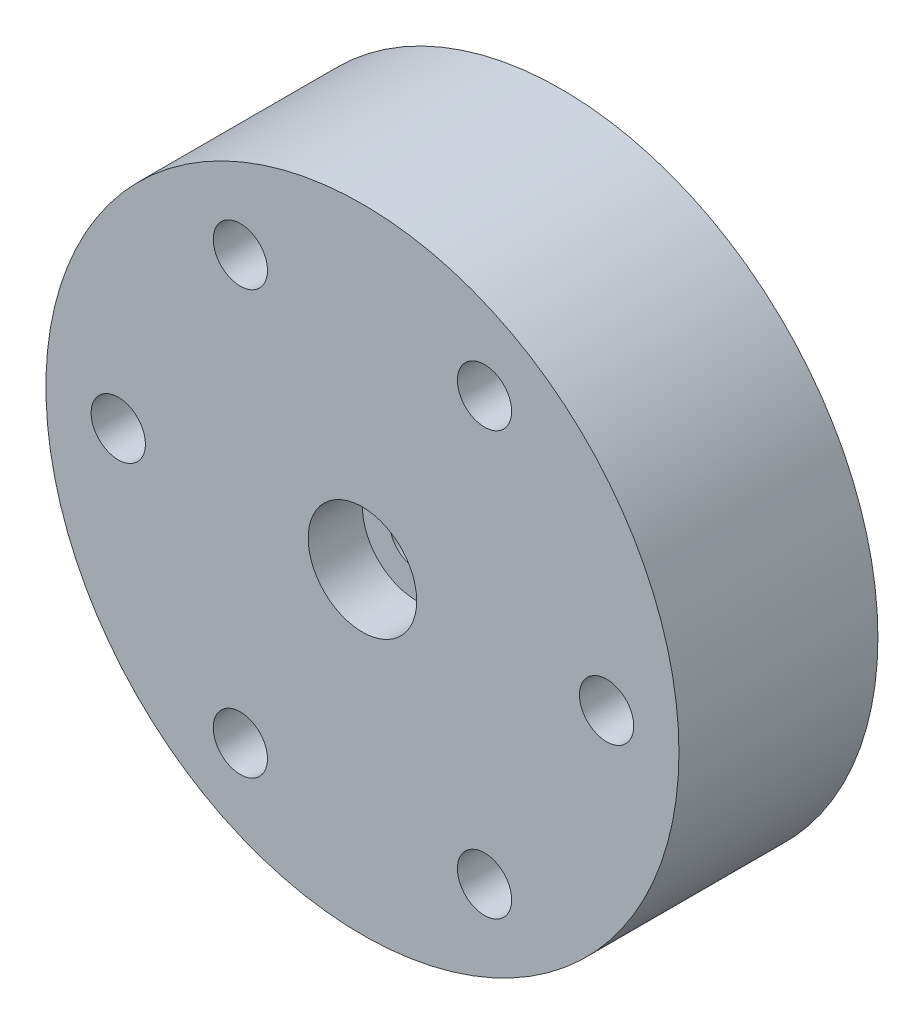
ISO-10303-21;
HEADER;
FILE_DESCRIPTION(('STEP AP214'),'2;1');
FILE_NAME('part.step','',(''),(''),'','','');
FILE_SCHEMA(('AUTOMOTIVE_DESIGN { 1 0 10303 214 1 1 1 1 }'));
ENDSEC;
DATA;
#1=APPLICATION_CONTEXT('core data for automotive mechanical design processes');
#2=APPLICATION_PROTOCOL_DEFINITION('international standard','automotive_design',2000,#1);
#3=PRODUCT_CONTEXT('',#1,'mechanical');
#4=PRODUCT('Part','Part','',(#3));
#5=PRODUCT_RELATED_PRODUCT_CATEGORY('part','',(#4));
#6=PRODUCT_DEFINITION_FORMATION('','',#4);
#7=PRODUCT_DEFINITION_CONTEXT('part definition',#1,'design');
#8=PRODUCT_DEFINITION('design','',#6,#7);
#9=PRODUCT_DEFINITION_SHAPE('','',#8);
#10=(LENGTH_UNIT() NAMED_UNIT(*) SI_UNIT(.MILLI.,.METRE.));
#11=(NAMED_UNIT(*) PLANE_ANGLE_UNIT() SI_UNIT($,.RADIAN.));
#12=(NAMED_UNIT(*) SI_UNIT($,.STERADIAN.) SOLID_ANGLE_UNIT());
#13=UNCERTAINTY_MEASURE_WITH_UNIT(LENGTH_MEASURE(1.E-05),#10,'distance_accuracy_value','');
#14=(GEOMETRIC_REPRESENTATION_CONTEXT(3) GLOBAL_UNCERTAINTY_ASSIGNED_CONTEXT((#13)) GLOBAL_UNIT_ASSIGNED_CONTEXT((#10,
#11,#12)) REPRESENTATION_CONTEXT('',''));
#15=CARTESIAN_POINT('',(0.,0.,0.));
#16=DIRECTION('',(0.,0.,1.));
#17=DIRECTION('',(1.,0.,0.));
#18=AXIS2_PLACEMENT_3D('',#15,#16,#17);
#19=CARTESIAN_POINT('',(0.,0.,11.));
#20=DIRECTION('',(0.,0.,-1.));
#21=DIRECTION('',(-1.,0.,0.));
#22=AXIS2_PLACEMENT_3D('',#19,#20,#21);
#23=CYLINDRICAL_SURFACE('',#22,17.5);
#24=CARTESIAN_POINT('',(0.,0.,11.));
#25=DIRECTION('',(0.,0.,1.));
#26=DIRECTION('',(1.,0.,0.));
#27=AXIS2_PLACEMENT_3D('',#24,#25,#26);
#28=CIRCLE('',#27,17.5);
#29=CARTESIAN_POINT('',(17.5,0.,11.));
#30=VERTEX_POINT('',#29);
#31=EDGE_CURVE('E10',#30,#30,#28,.T.);
#32=ORIENTED_EDGE('',*,*,#31,.F.);
#33=EDGE_LOOP('',(#32));
#34=FACE_BOUND('',#33,.T.);
#35=CARTESIAN_POINT('',(0.,0.,0.));
#36=DIRECTION('',(0.,0.,1.));
#37=DIRECTION('',(1.,0.,0.));
#38=AXIS2_PLACEMENT_3D('',#35,#36,#37);
#39=CIRCLE('',#38,17.5);
#40=CARTESIAN_POINT('',(17.5,0.,0.));
#41=VERTEX_POINT('',#40);
#42=EDGE_CURVE('E43',#41,#41,#39,.T.);
#43=ORIENTED_EDGE('',*,*,#42,.T.);
#44=EDGE_LOOP('',(#43));
#45=FACE_BOUND('',#44,.T.);
#46=ADVANCED_FACE('F40',(#34,#45),#23,.T.);
#47=CARTESIAN_POINT('',(0.,0.,11.));
#48=DIRECTION('',(0.,0.,1.));
#49=DIRECTION('',(1.,0.,0.));
#50=AXIS2_PLACEMENT_3D('',#47,#48,#49);
#51=PLANE('',#50);
#52=CARTESIAN_POINT('',(0.,0.,11.));
#53=DIRECTION('',(0.,0.,1.));
#54=DIRECTION('',(1.,0.,0.));
#55=AXIS2_PLACEMENT_3D('',#52,#53,#54);
#56=CIRCLE('',#55,3.);
#57=CARTESIAN_POINT('',(3.,0.,11.));
#58=VERTEX_POINT('',#57);
#59=EDGE_CURVE('E102',#58,#58,#56,.T.);
#60=ORIENTED_EDGE('',*,*,#59,.F.);
#61=EDGE_LOOP('',(#60));
#62=FACE_BOUND('',#61,.T.);
#63=CARTESIAN_POINT('',(6.75000000000014,-11.6913429510898,11.));
#64=DIRECTION('',(0.,0.,1.));
#65=DIRECTION('',(0.50000000000001,-0.866025403784433,0.));
#66=AXIS2_PLACEMENT_3D('',#63,#64,#65);
#67=CIRCLE('',#66,1.5);
#68=CARTESIAN_POINT('',(7.50000000000015,-12.9903810567665,11.));
#69=VERTEX_POINT('',#68);
#70=EDGE_CURVE('E70',#69,#69,#67,.T.);
#71=ORIENTED_EDGE('',*,*,#70,.F.);
#72=EDGE_LOOP('',(#71));
#73=FACE_BOUND('',#72,.T.);
#74=CARTESIAN_POINT('',(-6.74999999999989,-11.69134295109,11.));
#75=DIRECTION('',(0.,0.,1.));
#76=DIRECTION('',(-0.499999999999992,-0.866025403784443,0.));
#77=AXIS2_PLACEMENT_3D('',#74,#75,#76);
#78=CIRCLE('',#77,1.5);
#79=CARTESIAN_POINT('',(-7.49999999999988,-12.9903810567666,11.));
#80=VERTEX_POINT('',#79);
#81=EDGE_CURVE('E79',#80,#80,#78,.T.);
#82=ORIENTED_EDGE('',*,*,#81,.F.);
#83=EDGE_LOOP('',(#82));
#84=FACE_BOUND('',#83,.T.);
#85=CARTESIAN_POINT('',(-13.5,0.,11.));
#86=DIRECTION('',(0.,0.,1.));
#87=DIRECTION('',(-1.,0.,0.));
#88=AXIS2_PLACEMENT_3D('',#85,#86,#87);
#89=CIRCLE('',#88,1.5);
#90=CARTESIAN_POINT('',(-15.,0.,11.));
#91=VERTEX_POINT('',#90);
#92=EDGE_CURVE('E87',#91,#91,#89,.T.);
#93=ORIENTED_EDGE('',*,*,#92,.F.);
#94=EDGE_LOOP('',(#93));
#95=FACE_BOUND('',#94,.T.);
#96=CARTESIAN_POINT('',(-6.75000000000006,11.6913429510899,11.));
#97=DIRECTION('',(0.,0.,1.));
#98=DIRECTION('',(-0.500000000000004,0.866025403784436,0.));
#99=AXIS2_PLACEMENT_3D('',#96,#97,#98);
#100=CIRCLE('',#99,1.5);
#101=CARTESIAN_POINT('',(-7.50000000000006,12.9903810567665,11.));
#102=VERTEX_POINT('',#101);
#103=EDGE_CURVE('E95',#102,#102,#100,.T.);
#104=ORIENTED_EDGE('',*,*,#103,.F.);
#105=EDGE_LOOP('',(#104));
#106=FACE_BOUND('',#105,.T.);
#107=CARTESIAN_POINT('',(6.74999999999997,11.6913429510899,11.));
#108=DIRECTION('',(0.,0.,1.));
#109=DIRECTION('',(0.499999999999998,0.86602540378444,0.));
#110=AXIS2_PLACEMENT_3D('',#107,#108,#109);
#111=CIRCLE('',#110,1.5);
#112=CARTESIAN_POINT('',(7.49999999999997,12.9903810567666,11.));
#113=VERTEX_POINT('',#112);
#114=EDGE_CURVE('E62',#113,#113,#111,.T.);
#115=ORIENTED_EDGE('',*,*,#114,.F.);
#116=EDGE_LOOP('',(#115));
#117=FACE_BOUND('',#116,.T.);
#118=CARTESIAN_POINT('',(13.5,0.,11.));
#119=DIRECTION('',(0.,0.,1.));
#120=DIRECTION('',(1.,0.,0.));
#121=AXIS2_PLACEMENT_3D('',#118,#119,#120);
#122=CIRCLE('',#121,1.5);
#123=CARTESIAN_POINT('',(15.,0.,11.));
#124=VERTEX_POINT('',#123);
#125=EDGE_CURVE('E54',#124,#124,#122,.T.);
#126=ORIENTED_EDGE('',*,*,#125,.F.);
#127=EDGE_LOOP('',(#126));
#128=FACE_BOUND('',#127,.T.);
#129=ORIENTED_EDGE('',*,*,#31,.T.);
#130=EDGE_LOOP('',(#129));
#131=FACE_BOUND('',#130,.T.);
#132=ADVANCED_FACE('F139',(#62,#73,#84,#95,#106,#117,#128,#131),#51,.T.);
#133=CARTESIAN_POINT('',(0.,0.,0.));
#134=DIRECTION('',(0.,0.,1.));
#135=DIRECTION('',(1.,0.,0.));
#136=AXIS2_PLACEMENT_3D('',#133,#134,#135);
#137=PLANE('',#136);
#138=ORIENTED_EDGE('',*,*,#42,.F.);
#139=EDGE_LOOP('',(#138));
#140=FACE_BOUND('',#139,.T.);
#141=ADVANCED_FACE('F142',(#140),#137,.F.);
#142=CARTESIAN_POINT('',(13.5,0.,6.));
#143=DIRECTION('',(0.,0.,1.));
#144=DIRECTION('',(1.,0.,0.));
#145=AXIS2_PLACEMENT_3D('',#142,#143,#144);
#146=CYLINDRICAL_SURFACE('',#145,1.5);
#147=CARTESIAN_POINT('',(13.5,0.,6.));
#148=DIRECTION('',(0.,0.,1.));
#149=DIRECTION('',(1.,0.,0.));
#150=AXIS2_PLACEMENT_3D('',#147,#148,#149);
#151=CIRCLE('',#150,1.5);
#152=CARTESIAN_POINT('',(15.,0.,6.));
#153=VERTEX_POINT('',#152);
#154=EDGE_CURVE('E52',#153,#153,#151,.T.);
#155=ORIENTED_EDGE('',*,*,#154,.F.);
#156=EDGE_LOOP('',(#155));
#157=FACE_BOUND('',#156,.T.);
#158=ORIENTED_EDGE('',*,*,#125,.T.);
#159=EDGE_LOOP('',(#158));
#160=FACE_BOUND('',#159,.T.);
#161=ADVANCED_FACE('F156',(#157,#160),#146,.F.);
#162=CARTESIAN_POINT('',(13.5,0.,6.));
#163=DIRECTION('',(0.,0.,1.));
#164=DIRECTION('',(1.,0.,0.));
#165=AXIS2_PLACEMENT_3D('',#162,#163,#164);
#166=PLANE('',#165);
#167=ORIENTED_EDGE('',*,*,#154,.T.);
#168=EDGE_LOOP('',(#167));
#169=FACE_BOUND('',#168,.T.);
#170=ADVANCED_FACE('F158',(#169),#166,.T.);
#171=CARTESIAN_POINT('',(6.74999999999997,11.6913429510899,6.));
#172=DIRECTION('',(0.,0.,1.));
#173=DIRECTION('',(1.,0.,0.));
#174=AXIS2_PLACEMENT_3D('',#171,#172,#173);
#175=CYLINDRICAL_SURFACE('',#174,1.5);
#176=CARTESIAN_POINT('',(6.74999999999997,11.6913429510899,6.));
#177=DIRECTION('',(0.,0.,1.));
#178=DIRECTION('',(0.499999999999998,0.86602540378444,0.));
#179=AXIS2_PLACEMENT_3D('',#176,#177,#178);
#180=CIRCLE('',#179,1.5);
#181=CARTESIAN_POINT('',(7.49999999999997,12.9903810567666,6.));
#182=VERTEX_POINT('',#181);
#183=EDGE_CURVE('E58',#182,#182,#180,.T.);
#184=ORIENTED_EDGE('',*,*,#183,.F.);
#185=EDGE_LOOP('',(#184));
#186=FACE_BOUND('',#185,.T.);
#187=ORIENTED_EDGE('',*,*,#114,.T.);
#188=EDGE_LOOP('',(#187));
#189=FACE_BOUND('',#188,.T.);
#190=ADVANCED_FACE('F165',(#186,#189),#175,.F.);
#191=CARTESIAN_POINT('',(6.74999999999997,11.6913429510899,6.));
#192=DIRECTION('',(0.,0.,1.));
#193=DIRECTION('',(0.499999999999998,0.86602540378444,0.));
#194=AXIS2_PLACEMENT_3D('',#191,#192,#193);
#195=PLANE('',#194);
#196=ORIENTED_EDGE('',*,*,#183,.T.);
#197=EDGE_LOOP('',(#196));
#198=FACE_BOUND('',#197,.T.);
#199=ADVANCED_FACE('F208',(#198),#195,.T.);
#200=CARTESIAN_POINT('',(-6.75000000000006,11.6913429510899,6.));
#201=DIRECTION('',(0.,0.,1.));
#202=DIRECTION('',(1.,0.,0.));
#203=AXIS2_PLACEMENT_3D('',#200,#201,#202);
#204=CYLINDRICAL_SURFACE('',#203,1.5);
#205=CARTESIAN_POINT('',(-6.75000000000006,11.6913429510899,6.));
#206=DIRECTION('',(0.,0.,1.));
#207=DIRECTION('',(-0.500000000000004,0.866025403784436,0.));
#208=AXIS2_PLACEMENT_3D('',#205,#206,#207);
#209=CIRCLE('',#208,1.5);
#210=CARTESIAN_POINT('',(-7.50000000000006,12.9903810567665,6.));
#211=VERTEX_POINT('',#210);
#212=EDGE_CURVE('E66',#211,#211,#209,.T.);
#213=ORIENTED_EDGE('',*,*,#212,.F.);
#214=EDGE_LOOP('',(#213));
#215=FACE_BOUND('',#214,.T.);
#216=ORIENTED_EDGE('',*,*,#103,.T.);
#217=EDGE_LOOP('',(#216));
#218=FACE_BOUND('',#217,.T.);
#219=ADVANCED_FACE('F219',(#215,#218),#204,.F.);
#220=CARTESIAN_POINT('',(-6.75000000000006,11.6913429510899,6.));
#221=DIRECTION('',(0.,0.,1.));
#222=DIRECTION('',(-0.500000000000004,0.866025403784436,0.));
#223=AXIS2_PLACEMENT_3D('',#220,#221,#222);
#224=PLANE('',#223);
#225=ORIENTED_EDGE('',*,*,#212,.T.);
#226=EDGE_LOOP('',(#225));
#227=FACE_BOUND('',#226,.T.);
#228=ADVANCED_FACE('F230',(#227),#224,.T.);
#229=CARTESIAN_POINT('',(-13.5,0.,6.));
#230=DIRECTION('',(0.,0.,1.));
#231=DIRECTION('',(1.,0.,0.));
#232=AXIS2_PLACEMENT_3D('',#229,#230,#231);
#233=CYLINDRICAL_SURFACE('',#232,1.5);
#234=CARTESIAN_POINT('',(-13.5,0.,6.));
#235=DIRECTION('',(0.,0.,1.));
#236=DIRECTION('',(-1.,0.,0.));
#237=AXIS2_PLACEMENT_3D('',#234,#235,#236);
#238=CIRCLE('',#237,1.5);
#239=CARTESIAN_POINT('',(-15.,0.,6.));
#240=VERTEX_POINT('',#239);
#241=EDGE_CURVE('E91',#240,#240,#238,.T.);
#242=ORIENTED_EDGE('',*,*,#241,.F.);
#243=EDGE_LOOP('',(#242));
#244=FACE_BOUND('',#243,.T.);
#245=ORIENTED_EDGE('',*,*,#92,.T.);
#246=EDGE_LOOP('',(#245));
#247=FACE_BOUND('',#246,.T.);
#248=ADVANCED_FACE('F241',(#244,#247),#233,.F.);
#249=CARTESIAN_POINT('',(-13.5,0.,6.));
#250=DIRECTION('',(0.,0.,1.));
#251=DIRECTION('',(-1.,0.,0.));
#252=AXIS2_PLACEMENT_3D('',#249,#250,#251);
#253=PLANE('',#252);
#254=ORIENTED_EDGE('',*,*,#241,.T.);
#255=EDGE_LOOP('',(#254));
#256=FACE_BOUND('',#255,.T.);
#257=ADVANCED_FACE('F252',(#256),#253,.T.);
#258=CARTESIAN_POINT('',(-6.74999999999989,-11.69134295109,6.));
#259=DIRECTION('',(0.,0.,1.));
#260=DIRECTION('',(1.,0.,0.));
#261=AXIS2_PLACEMENT_3D('',#258,#259,#260);
#262=CYLINDRICAL_SURFACE('',#261,1.5);
#263=CARTESIAN_POINT('',(-6.74999999999989,-11.69134295109,6.));
#264=DIRECTION('',(0.,0.,1.));
#265=DIRECTION('',(-0.499999999999992,-0.866025403784443,0.));
#266=AXIS2_PLACEMENT_3D('',#263,#264,#265);
#267=CIRCLE('',#266,1.5);
#268=CARTESIAN_POINT('',(-7.49999999999988,-12.9903810567666,6.));
#269=VERTEX_POINT('',#268);
#270=EDGE_CURVE('E83',#269,#269,#267,.T.);
#271=ORIENTED_EDGE('',*,*,#270,.F.);
#272=EDGE_LOOP('',(#271));
#273=FACE_BOUND('',#272,.T.);
#274=ORIENTED_EDGE('',*,*,#81,.T.);
#275=EDGE_LOOP('',(#274));
#276=FACE_BOUND('',#275,.T.);
#277=ADVANCED_FACE('F263',(#273,#276),#262,.F.);
#278=CARTESIAN_POINT('',(-6.74999999999989,-11.69134295109,6.));
#279=DIRECTION('',(0.,0.,1.));
#280=DIRECTION('',(-0.499999999999992,-0.866025403784443,0.));
#281=AXIS2_PLACEMENT_3D('',#278,#279,#280);
#282=PLANE('',#281);
#283=ORIENTED_EDGE('',*,*,#270,.T.);
#284=EDGE_LOOP('',(#283));
#285=FACE_BOUND('',#284,.T.);
#286=ADVANCED_FACE('F274',(#285),#282,.T.);
#287=CARTESIAN_POINT('',(6.75000000000014,-11.6913429510898,6.));
#288=DIRECTION('',(0.,0.,1.));
#289=DIRECTION('',(1.,0.,0.));
#290=AXIS2_PLACEMENT_3D('',#287,#288,#289);
#291=CYLINDRICAL_SURFACE('',#290,1.5);
#292=CARTESIAN_POINT('',(6.75000000000014,-11.6913429510898,6.));
#293=DIRECTION('',(0.,0.,1.));
#294=DIRECTION('',(0.50000000000001,-0.866025403784433,0.));
#295=AXIS2_PLACEMENT_3D('',#292,#293,#294);
#296=CIRCLE('',#295,1.5);
#297=CARTESIAN_POINT('',(7.50000000000015,-12.9903810567665,6.));
#298=VERTEX_POINT('',#297);
#299=EDGE_CURVE('E74',#298,#298,#296,.T.);
#300=ORIENTED_EDGE('',*,*,#299,.F.);
#301=EDGE_LOOP('',(#300));
#302=FACE_BOUND('',#301,.T.);
#303=ORIENTED_EDGE('',*,*,#70,.T.);
#304=EDGE_LOOP('',(#303));
#305=FACE_BOUND('',#304,.T.);
#306=ADVANCED_FACE('F285',(#302,#305),#291,.F.);
#307=CARTESIAN_POINT('',(6.75000000000014,-11.6913429510898,6.));
#308=DIRECTION('',(0.,0.,1.));
#309=DIRECTION('',(0.50000000000001,-0.866025403784433,0.));
#310=AXIS2_PLACEMENT_3D('',#307,#308,#309);
#311=PLANE('',#310);
#312=ORIENTED_EDGE('',*,*,#299,.T.);
#313=EDGE_LOOP('',(#312));
#314=FACE_BOUND('',#313,.T.);
#315=ADVANCED_FACE('F135',(#314),#311,.T.);
#316=CARTESIAN_POINT('',(0.,0.,8.));
#317=DIRECTION('',(0.,0.,1.));
#318=DIRECTION('',(1.,0.,0.));
#319=AXIS2_PLACEMENT_3D('',#316,#317,#318);
#320=CYLINDRICAL_SURFACE('',#319,3.);
#321=CARTESIAN_POINT('',(0.,0.,8.));
#322=DIRECTION('',(0.,0.,1.));
#323=DIRECTION('',(1.,0.,0.));
#324=AXIS2_PLACEMENT_3D('',#321,#322,#323);
#325=CIRCLE('',#324,3.);
#326=CARTESIAN_POINT('',(3.,0.,8.));
#327=VERTEX_POINT('',#326);
#328=EDGE_CURVE('E75',#327,#327,#325,.T.);
#329=ORIENTED_EDGE('',*,*,#328,.F.);
#330=EDGE_LOOP('',(#329));
#331=FACE_BOUND('',#330,.T.);
#332=ORIENTED_EDGE('',*,*,#59,.T.);
#333=EDGE_LOOP('',(#332));
#334=FACE_BOUND('',#333,.T.);
#335=ADVANCED_FACE('F129',(#331,#334),#320,.F.);
#336=CARTESIAN_POINT('',(0.,0.,8.));
#337=DIRECTION('',(0.,0.,1.));
#338=DIRECTION('',(1.,0.,0.));
#339=AXIS2_PLACEMENT_3D('',#336,#337,#338);
#340=PLANE('',#339);
#341=CARTESIAN_POINT('',(0.,0.,8.));
#342=DIRECTION('',(0.,0.,1.));
#343=DIRECTION('',(1.,0.,0.));
#344=AXIS2_PLACEMENT_3D('',#341,#342,#343);
#345=CIRCLE('',#344,1.5);
#346=CARTESIAN_POINT('',(1.5,0.,8.));
#347=VERTEX_POINT('',#346);
#348=EDGE_CURVE('E110',#347,#347,#345,.T.);
#349=ORIENTED_EDGE('',*,*,#348,.F.);
#350=EDGE_LOOP('',(#349));
#351=FACE_BOUND('',#350,.T.);
#352=ORIENTED_EDGE('',*,*,#328,.T.);
#353=EDGE_LOOP('',(#352));
#354=FACE_BOUND('',#353,.T.);
#355=ADVANCED_FACE('F123',(#351,#354),#340,.T.);
#356=CARTESIAN_POINT('',(0.,0.,3.));
#357=DIRECTION('',(0.,0.,1.));
#358=DIRECTION('',(1.,0.,0.));
#359=AXIS2_PLACEMENT_3D('',#356,#357,#358);
#360=CYLINDRICAL_SURFACE('',#359,1.5);
#361=CARTESIAN_POINT('',(0.,0.,3.));
#362=DIRECTION('',(0.,0.,1.));
#363=DIRECTION('',(1.,0.,0.));
#364=AXIS2_PLACEMENT_3D('',#361,#362,#363);
#365=CIRCLE('',#364,1.5);
#366=CARTESIAN_POINT('',(1.5,0.,3.));
#367=VERTEX_POINT('',#366);
#368=EDGE_CURVE('E106',#367,#367,#365,.T.);
#369=ORIENTED_EDGE('',*,*,#368,.F.);
#370=EDGE_LOOP('',(#369));
#371=FACE_BOUND('',#370,.T.);
#372=ORIENTED_EDGE('',*,*,#348,.T.);
#373=EDGE_LOOP('',(#372));
#374=FACE_BOUND('',#373,.T.);
#375=ADVANCED_FACE('F120',(#371,#374),#360,.F.);
#376=CARTESIAN_POINT('',(0.,0.,3.));
#377=DIRECTION('',(0.,0.,1.));
#378=DIRECTION('',(1.,0.,0.));
#379=AXIS2_PLACEMENT_3D('',#376,#377,#378);
#380=PLANE('',#379);
#381=ORIENTED_EDGE('',*,*,#368,.T.);
#382=EDGE_LOOP('',(#381));
#383=FACE_BOUND('',#382,.T.);
#384=ADVANCED_FACE('F118',(#383),#380,.T.);
#385=CLOSED_SHELL('',(#46,#132,#141,#161,#170,#190,#199,#219,#228,#248,#257,#277,#286,#306,#315,
#335,#355,#375,#384));
#386=MANIFOLD_SOLID_BREP('B2',#385);
#387=ADVANCED_BREP_SHAPE_REPRESENTATION('',(#18,#386),#14);
#388=SHAPE_DEFINITION_REPRESENTATION(#9,#387);
ENDSEC;
END-ISO-10303-21;
